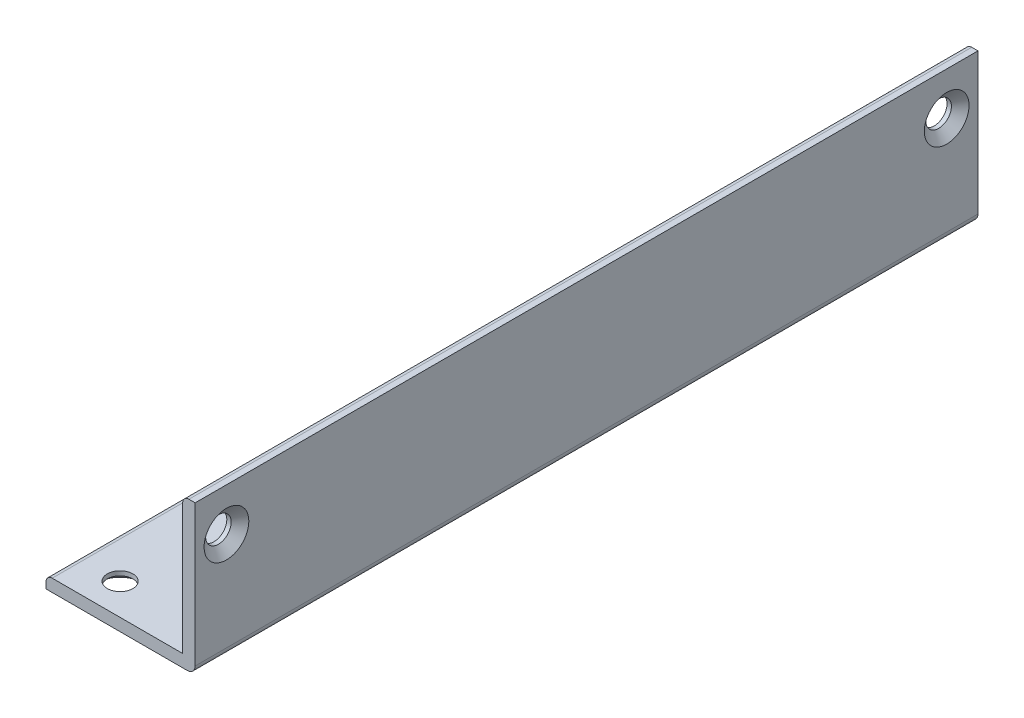
ISO-10303-21;
HEADER;
FILE_DESCRIPTION(('STEP AP214'),'2;1');
FILE_NAME('part.step','',(''),(''),'','','');
FILE_SCHEMA(('AUTOMOTIVE_DESIGN { 1 0 10303 214 1 1 1 1 }'));
ENDSEC;
DATA;
#1=APPLICATION_CONTEXT('core data for automotive mechanical design processes');
#2=APPLICATION_PROTOCOL_DEFINITION('international standard','automotive_design',2000,#1);
#3=PRODUCT_CONTEXT('',#1,'mechanical');
#4=PRODUCT('Part','Part','',(#3));
#5=PRODUCT_RELATED_PRODUCT_CATEGORY('part','',(#4));
#6=PRODUCT_DEFINITION_FORMATION('','',#4);
#7=PRODUCT_DEFINITION_CONTEXT('part definition',#1,'design');
#8=PRODUCT_DEFINITION('design','',#6,#7);
#9=PRODUCT_DEFINITION_SHAPE('','',#8);
#10=(LENGTH_UNIT() NAMED_UNIT(*) SI_UNIT(.MILLI.,.METRE.));
#11=(NAMED_UNIT(*) PLANE_ANGLE_UNIT() SI_UNIT($,.RADIAN.));
#12=(NAMED_UNIT(*) SI_UNIT($,.STERADIAN.) SOLID_ANGLE_UNIT());
#13=UNCERTAINTY_MEASURE_WITH_UNIT(LENGTH_MEASURE(1.E-05),#10,'distance_accuracy_value','');
#14=(GEOMETRIC_REPRESENTATION_CONTEXT(3) GLOBAL_UNCERTAINTY_ASSIGNED_CONTEXT((#13)) GLOBAL_UNIT_ASSIGNED_CONTEXT((#10,
#11,#12)) REPRESENTATION_CONTEXT('',''));
#15=CARTESIAN_POINT('',(0.,0.,0.));
#16=DIRECTION('',(0.,0.,1.));
#17=DIRECTION('',(1.,0.,0.));
#18=AXIS2_PLACEMENT_3D('',#15,#16,#17);
#19=CARTESIAN_POINT('',(8.73125,18.25625,-50.));
#20=DIRECTION('',(0.,0.,-1.));
#21=DIRECTION('',(-1.,0.,0.));
#22=AXIS2_PLACEMENT_3D('',#19,#20,#21);
#23=PLANE('',#22);
#24=DIRECTION('',(-1.,0.,0.));
#25=VECTOR('',#24,1.);
#26=CARTESIAN_POINT('',(7.14375000000001,1.5875,-50.));
#27=LINE('',#26,#25);
#28=CARTESIAN_POINT('',(7.93750000000001,1.5875,-50.));
#29=VERTEX_POINT('',#28);
#30=CARTESIAN_POINT('',(-8.73125,1.5875,-50.));
#31=VERTEX_POINT('',#30);
#32=EDGE_CURVE('E220',#29,#31,#27,.T.);
#33=ORIENTED_EDGE('',*,*,#32,.F.);
#34=DIRECTION('',(0.,-1.,0.));
#35=VECTOR('',#34,1.);
#36=CARTESIAN_POINT('',(7.9375,18.25625,-50.));
#37=LINE('',#36,#35);
#38=CARTESIAN_POINT('',(7.9375,18.25625,-50.));
#39=VERTEX_POINT('',#38);
#40=EDGE_CURVE('E148',#39,#29,#37,.T.);
#41=ORIENTED_EDGE('',*,*,#40,.F.);
#42=CARTESIAN_POINT('',(8.73125,18.25625,-50.));
#43=DIRECTION('',(0.,0.,1.));
#44=DIRECTION('',(-1.,0.,0.));
#45=AXIS2_PLACEMENT_3D('',#42,#43,#44);
#46=CIRCLE('',#45,0.793749999999999);
#47=CARTESIAN_POINT('',(8.73125,19.05,-50.));
#48=VERTEX_POINT('',#47);
#49=EDGE_CURVE('E217',#48,#39,#46,.T.);
#50=ORIENTED_EDGE('',*,*,#49,.F.);
#51=DIRECTION('',(-1.,0.,0.));
#52=VECTOR('',#51,1.);
#53=CARTESIAN_POINT('',(8.73125,19.05,-50.));
#54=LINE('',#53,#52);
#55=CARTESIAN_POINT('',(9.525,19.05,-50.));
#56=VERTEX_POINT('',#55);
#57=EDGE_CURVE('E215',#56,#48,#54,.T.);
#58=ORIENTED_EDGE('',*,*,#57,.F.);
#59=DIRECTION('',(0.,1.,0.));
#60=VECTOR('',#59,1.);
#61=CARTESIAN_POINT('',(9.525,0.,-50.));
#62=LINE('',#61,#60);
#63=CARTESIAN_POINT('',(9.525,1.,-50.));
#64=VERTEX_POINT('',#63);
#65=EDGE_CURVE('E213',#64,#56,#62,.T.);
#66=ORIENTED_EDGE('',*,*,#65,.F.);
#67=CARTESIAN_POINT('',(8.525,1.,-50.));
#68=DIRECTION('',(0.,0.,-1.));
#69=DIRECTION('',(-1.,0.,0.));
#70=AXIS2_PLACEMENT_3D('',#67,#68,#69);
#71=CIRCLE('',#70,1.);
#72=CARTESIAN_POINT('',(8.525,0.,-50.));
#73=VERTEX_POINT('',#72);
#74=EDGE_CURVE('E253',#64,#73,#71,.T.);
#75=ORIENTED_EDGE('',*,*,#74,.T.);
#76=DIRECTION('',(1.,0.,0.));
#77=VECTOR('',#76,1.);
#78=CARTESIAN_POINT('',(-9.525,0.,-50.));
#79=LINE('',#78,#77);
#80=CARTESIAN_POINT('',(-9.525,0.,-50.));
#81=VERTEX_POINT('',#80);
#82=EDGE_CURVE('E211',#81,#73,#79,.T.);
#83=ORIENTED_EDGE('',*,*,#82,.F.);
#84=DIRECTION('',(0.,-1.,0.));
#85=VECTOR('',#84,1.);
#86=CARTESIAN_POINT('',(-9.525,0.793749999999998,-50.));
#87=LINE('',#86,#85);
#88=CARTESIAN_POINT('',(-9.525,0.793749999999998,-50.));
#89=VERTEX_POINT('',#88);
#90=EDGE_CURVE('E208',#89,#81,#87,.T.);
#91=ORIENTED_EDGE('',*,*,#90,.F.);
#92=CARTESIAN_POINT('',(-8.73125,0.793749999999998,-50.));
#93=DIRECTION('',(0.,0.,1.));
#94=DIRECTION('',(-1.,0.,0.));
#95=AXIS2_PLACEMENT_3D('',#92,#93,#94);
#96=CIRCLE('',#95,0.793749999999998);
#97=EDGE_CURVE('E194',#31,#89,#96,.T.);
#98=ORIENTED_EDGE('',*,*,#97,.F.);
#99=EDGE_LOOP('',(#33,#41,#50,#58,#66,#75,#83,#91,#98));
#100=FACE_BOUND('',#99,.T.);
#101=ADVANCED_FACE('F35',(#100),#23,.T.);
#102=CARTESIAN_POINT('',(-9.525,0.793749999999998,50.));
#103=DIRECTION('',(1.,0.,0.));
#104=DIRECTION('',(0.,0.,-1.));
#105=AXIS2_PLACEMENT_3D('',#102,#103,#104);
#106=PLANE('',#105);
#107=ORIENTED_EDGE('',*,*,#90,.T.);
#108=DIRECTION('',(0.,0.,-1.));
#109=VECTOR('',#108,1.);
#110=CARTESIAN_POINT('',(-9.525,0.,50.));
#111=LINE('',#110,#109);
#112=CARTESIAN_POINT('',(-9.525,0.,50.));
#113=VERTEX_POINT('',#112);
#114=EDGE_CURVE('E239',#113,#81,#111,.T.);
#115=ORIENTED_EDGE('',*,*,#114,.F.);
#116=DIRECTION('',(0.,-1.,0.));
#117=VECTOR('',#116,1.);
#118=CARTESIAN_POINT('',(-9.525,0.793749999999998,50.));
#119=LINE('',#118,#117);
#120=CARTESIAN_POINT('',(-9.525,0.793749999999998,50.));
#121=VERTEX_POINT('',#120);
#122=EDGE_CURVE('E190',#121,#113,#119,.T.);
#123=ORIENTED_EDGE('',*,*,#122,.F.);
#124=DIRECTION('',(0.,0.,-1.));
#125=VECTOR('',#124,1.);
#126=CARTESIAN_POINT('',(-9.525,0.793749999999998,50.));
#127=LINE('',#126,#125);
#128=EDGE_CURVE('E207',#121,#89,#127,.T.);
#129=ORIENTED_EDGE('',*,*,#128,.T.);
#130=EDGE_LOOP('',(#107,#115,#123,#129));
#131=FACE_BOUND('',#130,.T.);
#132=ADVANCED_FACE('F294',(#131),#106,.F.);
#133=CARTESIAN_POINT('',(-9.525,0.,50.));
#134=DIRECTION('',(0.,1.,0.));
#135=DIRECTION('',(0.,0.,1.));
#136=AXIS2_PLACEMENT_3D('',#133,#134,#135);
#137=PLANE('',#136);
#138=CARTESIAN_POINT('',(-4.06250000000001,0.,46.));
#139=DIRECTION('',(0.,-1.,0.));
#140=DIRECTION('',(0.,0.,-1.));
#141=AXIS2_PLACEMENT_3D('',#138,#139,#140);
#142=CIRCLE('',#141,2.8575);
#143=CARTESIAN_POINT('',(-4.06250000000001,0.,43.1425));
#144=VERTEX_POINT('',#143);
#145=EDGE_CURVE('E176',#144,#144,#142,.T.);
#146=ORIENTED_EDGE('',*,*,#145,.F.);
#147=EDGE_LOOP('',(#146));
#148=FACE_BOUND('',#147,.T.);
#149=CARTESIAN_POINT('',(-4.0625,0.,-46.));
#150=DIRECTION('',(0.,-1.,0.));
#151=DIRECTION('',(0.,0.,-1.));
#152=AXIS2_PLACEMENT_3D('',#149,#150,#151);
#153=CIRCLE('',#152,2.8575);
#154=CARTESIAN_POINT('',(-4.0625,0.,-48.8575));
#155=VERTEX_POINT('',#154);
#156=EDGE_CURVE('E183',#155,#155,#153,.T.);
#157=ORIENTED_EDGE('',*,*,#156,.F.);
#158=EDGE_LOOP('',(#157));
#159=FACE_BOUND('',#158,.T.);
#160=ORIENTED_EDGE('',*,*,#82,.T.);
#161=DIRECTION('',(0.,0.,-1.));
#162=VECTOR('',#161,1.);
#163=CARTESIAN_POINT('',(8.525,0.,50.));
#164=LINE('',#163,#162);
#165=CARTESIAN_POINT('',(8.525,0.,50.));
#166=VERTEX_POINT('',#165);
#167=EDGE_CURVE('E43',#73,#166,#164,.F.);
#168=ORIENTED_EDGE('',*,*,#167,.T.);
#169=DIRECTION('',(1.,0.,0.));
#170=VECTOR('',#169,1.);
#171=CARTESIAN_POINT('',(-9.525,0.,50.));
#172=LINE('',#171,#170);
#173=EDGE_CURVE('E193',#113,#166,#172,.T.);
#174=ORIENTED_EDGE('',*,*,#173,.F.);
#175=ORIENTED_EDGE('',*,*,#114,.T.);
#176=EDGE_LOOP('',(#160,#168,#174,#175));
#177=FACE_BOUND('',#176,.T.);
#178=ADVANCED_FACE('F260',(#148,#159,#177),#137,.F.);
#179=CARTESIAN_POINT('',(9.525,0.,50.));
#180=DIRECTION('',(-1.,0.,0.));
#181=DIRECTION('',(0.,0.,1.));
#182=AXIS2_PLACEMENT_3D('',#179,#180,#181);
#183=PLANE('',#182);
#184=CARTESIAN_POINT('',(9.525,13.5875,46.));
#185=DIRECTION('',(1.,0.,0.));
#186=DIRECTION('',(0.,0.,-1.));
#187=AXIS2_PLACEMENT_3D('',#184,#185,#186);
#188=CIRCLE('',#187,2.8575);
#189=CARTESIAN_POINT('',(9.525,13.5875,43.1425));
#190=VERTEX_POINT('',#189);
#191=EDGE_CURVE('E162',#190,#190,#188,.T.);
#192=ORIENTED_EDGE('',*,*,#191,.F.);
#193=EDGE_LOOP('',(#192));
#194=FACE_BOUND('',#193,.T.);
#195=CARTESIAN_POINT('',(9.525,13.5875,-46.));
#196=DIRECTION('',(1.,0.,0.));
#197=DIRECTION('',(0.,0.,-1.));
#198=AXIS2_PLACEMENT_3D('',#195,#196,#197);
#199=CIRCLE('',#198,2.8575);
#200=CARTESIAN_POINT('',(9.525,13.5875,-48.8575));
#201=VERTEX_POINT('',#200);
#202=EDGE_CURVE('E169',#201,#201,#199,.T.);
#203=ORIENTED_EDGE('',*,*,#202,.F.);
#204=EDGE_LOOP('',(#203));
#205=FACE_BOUND('',#204,.T.);
#206=DIRECTION('',(0.,1.,0.));
#207=VECTOR('',#206,1.);
#208=CARTESIAN_POINT('',(9.525,0.,50.));
#209=LINE('',#208,#207);
#210=CARTESIAN_POINT('',(9.525,1.,50.));
#211=VERTEX_POINT('',#210);
#212=CARTESIAN_POINT('',(9.525,19.05,50.));
#213=VERTEX_POINT('',#212);
#214=EDGE_CURVE('E196',#211,#213,#209,.T.);
#215=ORIENTED_EDGE('',*,*,#214,.F.);
#216=DIRECTION('',(0.,0.,-1.));
#217=VECTOR('',#216,1.);
#218=CARTESIAN_POINT('',(9.525,1.,50.));
#219=LINE('',#218,#217);
#220=EDGE_CURVE('E242',#211,#64,#219,.T.);
#221=ORIENTED_EDGE('',*,*,#220,.T.);
#222=ORIENTED_EDGE('',*,*,#65,.T.);
#223=DIRECTION('',(0.,0.,-1.));
#224=VECTOR('',#223,1.);
#225=CARTESIAN_POINT('',(9.525,19.05,50.));
#226=LINE('',#225,#224);
#227=EDGE_CURVE('E236',#213,#56,#226,.T.);
#228=ORIENTED_EDGE('',*,*,#227,.F.);
#229=EDGE_LOOP('',(#215,#221,#222,#228));
#230=FACE_BOUND('',#229,.T.);
#231=ADVANCED_FACE('F268',(#194,#205,#230),#183,.F.);
#232=CARTESIAN_POINT('',(8.73125,19.05,50.));
#233=DIRECTION('',(0.,-1.,0.));
#234=DIRECTION('',(0.,0.,-1.));
#235=AXIS2_PLACEMENT_3D('',#232,#233,#234);
#236=PLANE('',#235);
#237=ORIENTED_EDGE('',*,*,#57,.T.);
#238=DIRECTION('',(0.,0.,-1.));
#239=VECTOR('',#238,1.);
#240=CARTESIAN_POINT('',(8.73125,19.05,50.));
#241=LINE('',#240,#239);
#242=CARTESIAN_POINT('',(8.73125,19.05,50.));
#243=VERTEX_POINT('',#242);
#244=EDGE_CURVE('E233',#243,#48,#241,.T.);
#245=ORIENTED_EDGE('',*,*,#244,.F.);
#246=DIRECTION('',(-1.,0.,0.));
#247=VECTOR('',#246,1.);
#248=CARTESIAN_POINT('',(8.73125,19.05,50.));
#249=LINE('',#248,#247);
#250=EDGE_CURVE('E198',#213,#243,#249,.T.);
#251=ORIENTED_EDGE('',*,*,#250,.F.);
#252=ORIENTED_EDGE('',*,*,#227,.T.);
#253=EDGE_LOOP('',(#237,#245,#251,#252));
#254=FACE_BOUND('',#253,.T.);
#255=ADVANCED_FACE('F272',(#254),#236,.F.);
#256=CARTESIAN_POINT('',(8.73125,18.25625,50.));
#257=DIRECTION('',(0.,0.,-1.));
#258=DIRECTION('',(-1.,0.,0.));
#259=AXIS2_PLACEMENT_3D('',#256,#257,#258);
#260=CYLINDRICAL_SURFACE('',#259,0.793749999999999);
#261=ORIENTED_EDGE('',*,*,#49,.T.);
#262=DIRECTION('',(0.,0.,-1.));
#263=VECTOR('',#262,1.);
#264=CARTESIAN_POINT('',(7.9375,18.25625,50.));
#265=LINE('',#264,#263);
#266=CARTESIAN_POINT('',(7.9375,18.25625,50.));
#267=VERTEX_POINT('',#266);
#268=EDGE_CURVE('E231',#267,#39,#265,.T.);
#269=ORIENTED_EDGE('',*,*,#268,.F.);
#270=CARTESIAN_POINT('',(8.73125,18.25625,50.));
#271=DIRECTION('',(0.,0.,1.));
#272=DIRECTION('',(-1.,0.,0.));
#273=AXIS2_PLACEMENT_3D('',#270,#271,#272);
#274=CIRCLE('',#273,0.793749999999999);
#275=EDGE_CURVE('E200',#243,#267,#274,.T.);
#276=ORIENTED_EDGE('',*,*,#275,.F.);
#277=ORIENTED_EDGE('',*,*,#244,.T.);
#278=EDGE_LOOP('',(#261,#269,#276,#277));
#279=FACE_BOUND('',#278,.T.);
#280=ADVANCED_FACE('F277',(#279),#260,.T.);
#281=CARTESIAN_POINT('',(7.9375,18.25625,50.));
#282=DIRECTION('',(1.,0.,0.));
#283=DIRECTION('',(0.,1.,0.));
#284=AXIS2_PLACEMENT_3D('',#281,#282,#283);
#285=PLANE('',#284);
#286=ORIENTED_EDGE('',*,*,#40,.T.);
#287=DIRECTION('',(0.,0.,-1.));
#288=VECTOR('',#287,1.);
#289=CARTESIAN_POINT('',(7.93750000000001,1.5875,-25.));
#290=LINE('',#289,#288);
#291=CARTESIAN_POINT('',(7.93750000000001,1.5875,-25.));
#292=VERTEX_POINT('',#291);
#293=EDGE_CURVE('E128',#292,#29,#290,.T.);
#294=ORIENTED_EDGE('',*,*,#293,.F.);
#295=DIRECTION('',(0.,1.,0.));
#296=VECTOR('',#295,1.);
#297=CARTESIAN_POINT('',(7.93750000000001,6.5875,-25.));
#298=LINE('',#297,#296);
#299=CARTESIAN_POINT('',(7.93750000000001,2.38125,-25.));
#300=VERTEX_POINT('',#299);
#301=EDGE_CURVE('E134',#292,#300,#298,.T.);
#302=ORIENTED_EDGE('',*,*,#301,.T.);
#303=DIRECTION('',(0.,0.,-1.));
#304=VECTOR('',#303,1.);
#305=CARTESIAN_POINT('',(7.93750000000001,2.38125,50.));
#306=LINE('',#305,#304);
#307=CARTESIAN_POINT('',(7.93750000000001,2.38125,25.));
#308=VERTEX_POINT('',#307);
#309=EDGE_CURVE('E229',#308,#300,#306,.T.);
#310=ORIENTED_EDGE('',*,*,#309,.F.);
#311=DIRECTION('',(0.,1.,0.));
#312=VECTOR('',#311,1.);
#313=CARTESIAN_POINT('',(7.93750000000001,6.5875,25.));
#314=LINE('',#313,#312);
#315=CARTESIAN_POINT('',(7.93750000000001,1.5875,25.));
#316=VERTEX_POINT('',#315);
#317=EDGE_CURVE('E154',#316,#308,#314,.T.);
#318=ORIENTED_EDGE('',*,*,#317,.F.);
#319=DIRECTION('',(0.,0.,1.));
#320=VECTOR('',#319,1.);
#321=CARTESIAN_POINT('',(7.93750000000001,1.5875,25.));
#322=LINE('',#321,#320);
#323=CARTESIAN_POINT('',(7.93750000000001,1.5875,50.));
#324=VERTEX_POINT('',#323);
#325=EDGE_CURVE('E156',#316,#324,#322,.T.);
#326=ORIENTED_EDGE('',*,*,#325,.T.);
#327=DIRECTION('',(0.,-1.,0.));
#328=VECTOR('',#327,1.);
#329=CARTESIAN_POINT('',(7.9375,18.25625,50.));
#330=LINE('',#329,#328);
#331=EDGE_CURVE('E202',#267,#324,#330,.T.);
#332=ORIENTED_EDGE('',*,*,#331,.F.);
#333=ORIENTED_EDGE('',*,*,#268,.T.);
#334=EDGE_LOOP('',(#286,#294,#302,#310,#318,#326,#332,#333));
#335=FACE_BOUND('',#334,.T.);
#336=CARTESIAN_POINT('',(7.93750000000001,13.5875,-46.));
#337=DIRECTION('',(1.,0.,0.));
#338=DIRECTION('',(0.,1.,0.));
#339=AXIS2_PLACEMENT_3D('',#336,#337,#338);
#340=CIRCLE('',#339,1.63195);
#341=CARTESIAN_POINT('',(7.93750000000001,15.21945,-46.));
#342=VERTEX_POINT('',#341);
#343=EDGE_CURVE('E175',#342,#342,#340,.T.);
#344=ORIENTED_EDGE('',*,*,#343,.T.);
#345=EDGE_LOOP('',(#344));
#346=FACE_BOUND('',#345,.T.);
#347=CARTESIAN_POINT('',(7.93750000000001,13.5875,46.));
#348=DIRECTION('',(1.,0.,0.));
#349=DIRECTION('',(0.,1.,0.));
#350=AXIS2_PLACEMENT_3D('',#347,#348,#349);
#351=CIRCLE('',#350,1.63195);
#352=CARTESIAN_POINT('',(7.93750000000001,15.21945,46.));
#353=VERTEX_POINT('',#352);
#354=EDGE_CURVE('E168',#353,#353,#351,.T.);
#355=ORIENTED_EDGE('',*,*,#354,.T.);
#356=EDGE_LOOP('',(#355));
#357=FACE_BOUND('',#356,.T.);
#358=ADVANCED_FACE('F144',(#335,#346,#357),#285,.F.);
#359=CARTESIAN_POINT('',(7.14375000000001,2.38125,50.));
#360=DIRECTION('',(0.,0.,-1.));
#361=DIRECTION('',(-1.,0.,0.));
#362=AXIS2_PLACEMENT_3D('',#359,#360,#361);
#363=CYLINDRICAL_SURFACE('',#362,0.793749999999999);
#364=ORIENTED_EDGE('',*,*,#309,.T.);
#365=CARTESIAN_POINT('',(7.14375000000001,2.38125,-25.));
#366=DIRECTION('',(0.,0.,1.));
#367=DIRECTION('',(1.,0.,0.));
#368=AXIS2_PLACEMENT_3D('',#365,#366,#367);
#369=CIRCLE('',#368,0.793749999999999);
#370=CARTESIAN_POINT('',(7.14375000000001,1.5875,-25.));
#371=VERTEX_POINT('',#370);
#372=EDGE_CURVE('E138',#300,#371,#369,.F.);
#373=ORIENTED_EDGE('',*,*,#372,.T.);
#374=DIRECTION('',(0.,0.,-1.));
#375=VECTOR('',#374,1.);
#376=CARTESIAN_POINT('',(7.14375000000001,1.5875,50.));
#377=LINE('',#376,#375);
#378=CARTESIAN_POINT('',(7.14375000000001,1.5875,25.));
#379=VERTEX_POINT('',#378);
#380=EDGE_CURVE('E131',#379,#371,#377,.T.);
#381=ORIENTED_EDGE('',*,*,#380,.F.);
#382=CARTESIAN_POINT('',(7.14375000000001,2.38125,25.));
#383=DIRECTION('',(0.,0.,-1.));
#384=DIRECTION('',(-1.,0.,0.));
#385=AXIS2_PLACEMENT_3D('',#382,#383,#384);
#386=CIRCLE('',#385,0.793749999999999);
#387=EDGE_CURVE('E159',#379,#308,#386,.F.);
#388=ORIENTED_EDGE('',*,*,#387,.T.);
#389=EDGE_LOOP('',(#364,#373,#381,#388));
#390=FACE_BOUND('',#389,.T.);
#391=ADVANCED_FACE('F282',(#390),#363,.F.);
#392=CARTESIAN_POINT('',(7.14375000000001,1.5875,50.));
#393=DIRECTION('',(0.,-1.,0.));
#394=DIRECTION('',(1.,0.,0.));
#395=AXIS2_PLACEMENT_3D('',#392,#393,#394);
#396=PLANE('',#395);
#397=ORIENTED_EDGE('',*,*,#32,.T.);
#398=DIRECTION('',(0.,0.,-1.));
#399=VECTOR('',#398,1.);
#400=CARTESIAN_POINT('',(-8.73125,1.5875,50.));
#401=LINE('',#400,#399);
#402=CARTESIAN_POINT('',(-8.73125,1.5875,50.));
#403=VERTEX_POINT('',#402);
#404=EDGE_CURVE('E225',#403,#31,#401,.T.);
#405=ORIENTED_EDGE('',*,*,#404,.F.);
#406=DIRECTION('',(-1.,0.,0.));
#407=VECTOR('',#406,1.);
#408=CARTESIAN_POINT('',(7.14375000000001,1.5875,50.));
#409=LINE('',#408,#407);
#410=EDGE_CURVE('E50',#324,#403,#409,.T.);
#411=ORIENTED_EDGE('',*,*,#410,.F.);
#412=ORIENTED_EDGE('',*,*,#325,.F.);
#413=DIRECTION('',(1.,0.,0.));
#414=VECTOR('',#413,1.);
#415=CARTESIAN_POINT('',(2.9375,1.5875,25.));
#416=LINE('',#415,#414);
#417=EDGE_CURVE('E150',#379,#316,#416,.T.);
#418=ORIENTED_EDGE('',*,*,#417,.F.);
#419=ORIENTED_EDGE('',*,*,#380,.T.);
#420=DIRECTION('',(1.,0.,0.));
#421=VECTOR('',#420,1.);
#422=CARTESIAN_POINT('',(2.9375,1.5875,-25.));
#423=LINE('',#422,#421);
#424=EDGE_CURVE('E123',#371,#292,#423,.T.);
#425=ORIENTED_EDGE('',*,*,#424,.T.);
#426=ORIENTED_EDGE('',*,*,#293,.T.);
#427=EDGE_LOOP('',(#397,#405,#411,#412,#418,#419,#425,#426));
#428=FACE_BOUND('',#427,.T.);
#429=CARTESIAN_POINT('',(-4.0625,1.5875,-46.));
#430=DIRECTION('',(0.,-1.,0.));
#431=DIRECTION('',(1.,0.,0.));
#432=AXIS2_PLACEMENT_3D('',#429,#430,#431);
#433=CIRCLE('',#432,1.63195);
#434=CARTESIAN_POINT('',(-2.43055,1.5875,-46.));
#435=VERTEX_POINT('',#434);
#436=EDGE_CURVE('E189',#435,#435,#433,.T.);
#437=ORIENTED_EDGE('',*,*,#436,.T.);
#438=EDGE_LOOP('',(#437));
#439=FACE_BOUND('',#438,.T.);
#440=CARTESIAN_POINT('',(-4.06250000000001,1.5875,46.));
#441=DIRECTION('',(0.,-1.,0.));
#442=DIRECTION('',(1.,0.,0.));
#443=AXIS2_PLACEMENT_3D('',#440,#441,#442);
#444=CIRCLE('',#443,1.63195);
#445=CARTESIAN_POINT('',(-2.43055000000001,1.5875,46.));
#446=VERTEX_POINT('',#445);
#447=EDGE_CURVE('E182',#446,#446,#444,.T.);
#448=ORIENTED_EDGE('',*,*,#447,.T.);
#449=EDGE_LOOP('',(#448));
#450=FACE_BOUND('',#449,.T.);
#451=ADVANCED_FACE('F125',(#428,#439,#450),#396,.F.);
#452=CARTESIAN_POINT('',(-8.73125,0.793749999999998,50.));
#453=DIRECTION('',(0.,0.,-1.));
#454=DIRECTION('',(-1.,0.,0.));
#455=AXIS2_PLACEMENT_3D('',#452,#453,#454);
#456=CYLINDRICAL_SURFACE('',#455,0.793749999999998);
#457=ORIENTED_EDGE('',*,*,#97,.T.);
#458=ORIENTED_EDGE('',*,*,#128,.F.);
#459=CARTESIAN_POINT('',(-8.73125,0.793749999999998,50.));
#460=DIRECTION('',(0.,0.,1.));
#461=DIRECTION('',(-1.,0.,0.));
#462=AXIS2_PLACEMENT_3D('',#459,#460,#461);
#463=CIRCLE('',#462,0.793749999999998);
#464=EDGE_CURVE('E205',#403,#121,#463,.T.);
#465=ORIENTED_EDGE('',*,*,#464,.F.);
#466=ORIENTED_EDGE('',*,*,#404,.T.);
#467=EDGE_LOOP('',(#457,#458,#465,#466));
#468=FACE_BOUND('',#467,.T.);
#469=ADVANCED_FACE('F303',(#468),#456,.T.);
#470=CARTESIAN_POINT('',(8.73125,18.25625,50.));
#471=DIRECTION('',(0.,0.,-1.));
#472=DIRECTION('',(-1.,0.,0.));
#473=AXIS2_PLACEMENT_3D('',#470,#471,#472);
#474=PLANE('',#473);
#475=ORIENTED_EDGE('',*,*,#331,.T.);
#476=ORIENTED_EDGE('',*,*,#410,.T.);
#477=ORIENTED_EDGE('',*,*,#464,.T.);
#478=ORIENTED_EDGE('',*,*,#122,.T.);
#479=ORIENTED_EDGE('',*,*,#173,.T.);
#480=CARTESIAN_POINT('',(8.525,1.,50.));
#481=DIRECTION('',(0.,0.,-1.));
#482=DIRECTION('',(-1.,0.,0.));
#483=AXIS2_PLACEMENT_3D('',#480,#481,#482);
#484=CIRCLE('',#483,1.);
#485=EDGE_CURVE('E11',#166,#211,#484,.F.);
#486=ORIENTED_EDGE('',*,*,#485,.T.);
#487=ORIENTED_EDGE('',*,*,#214,.T.);
#488=ORIENTED_EDGE('',*,*,#250,.T.);
#489=ORIENTED_EDGE('',*,*,#275,.T.);
#490=EDGE_LOOP('',(#475,#476,#477,#478,#479,#486,#487,#488,#489));
#491=FACE_BOUND('',#490,.T.);
#492=ADVANCED_FACE('F265',(#491),#474,.F.);
#493=CARTESIAN_POINT('',(-4.0625,0.,-46.));
#494=DIRECTION('',(0.,-1.,0.));
#495=DIRECTION('',(0.,0.,-1.));
#496=AXIS2_PLACEMENT_3D('',#493,#494,#495);
#497=CYLINDRICAL_SURFACE('',#496,1.63195);
#498=CARTESIAN_POINT('',(-4.0625,1.02835855298932,-46.));
#499=DIRECTION('',(0.,-1.,0.));
#500=DIRECTION('',(0.,0.,-1.));
#501=AXIS2_PLACEMENT_3D('',#498,#499,#500);
#502=CIRCLE('',#501,1.63195);
#503=CARTESIAN_POINT('',(-4.0625,1.02835855298932,-47.63195));
#504=VERTEX_POINT('',#503);
#505=EDGE_CURVE('E186',#504,#504,#502,.T.);
#506=ORIENTED_EDGE('',*,*,#505,.T.);
#507=EDGE_LOOP('',(#506));
#508=FACE_BOUND('',#507,.T.);
#509=ORIENTED_EDGE('',*,*,#436,.F.);
#510=EDGE_LOOP('',(#509));
#511=FACE_BOUND('',#510,.T.);
#512=ADVANCED_FACE('F331',(#508,#511),#497,.F.);
#513=CARTESIAN_POINT('',(-4.0625,0.,-46.));
#514=DIRECTION('',(0.,-1.,0.));
#515=DIRECTION('',(0.,0.,-1.));
#516=AXIS2_PLACEMENT_3D('',#513,#514,#515);
#517=CONICAL_SURFACE('',#516,2.8575,0.872664625997165);
#518=ORIENTED_EDGE('',*,*,#505,.F.);
#519=EDGE_LOOP('',(#518));
#520=FACE_BOUND('',#519,.T.);
#521=ORIENTED_EDGE('',*,*,#156,.T.);
#522=EDGE_LOOP('',(#521));
#523=FACE_BOUND('',#522,.T.);
#524=ADVANCED_FACE('F328',(#520,#523),#517,.F.);
#525=CARTESIAN_POINT('',(-4.06250000000001,0.,46.));
#526=DIRECTION('',(0.,-1.,0.));
#527=DIRECTION('',(0.,0.,-1.));
#528=AXIS2_PLACEMENT_3D('',#525,#526,#527);
#529=CYLINDRICAL_SURFACE('',#528,1.63195);
#530=CARTESIAN_POINT('',(-4.06250000000001,1.02835855298932,46.));
#531=DIRECTION('',(0.,-1.,0.));
#532=DIRECTION('',(0.,0.,-1.));
#533=AXIS2_PLACEMENT_3D('',#530,#531,#532);
#534=CIRCLE('',#533,1.63195);
#535=CARTESIAN_POINT('',(-4.06250000000001,1.02835855298932,44.36805));
#536=VERTEX_POINT('',#535);
#537=EDGE_CURVE('E179',#536,#536,#534,.T.);
#538=ORIENTED_EDGE('',*,*,#537,.T.);
#539=EDGE_LOOP('',(#538));
#540=FACE_BOUND('',#539,.T.);
#541=ORIENTED_EDGE('',*,*,#447,.F.);
#542=EDGE_LOOP('',(#541));
#543=FACE_BOUND('',#542,.T.);
#544=ADVANCED_FACE('F330',(#540,#543),#529,.F.);
#545=CARTESIAN_POINT('',(-4.06250000000001,0.,46.));
#546=DIRECTION('',(0.,-1.,0.));
#547=DIRECTION('',(0.,0.,-1.));
#548=AXIS2_PLACEMENT_3D('',#545,#546,#547);
#549=CONICAL_SURFACE('',#548,2.8575,0.872664625997165);
#550=ORIENTED_EDGE('',*,*,#537,.F.);
#551=EDGE_LOOP('',(#550));
#552=FACE_BOUND('',#551,.T.);
#553=ORIENTED_EDGE('',*,*,#145,.T.);
#554=EDGE_LOOP('',(#553));
#555=FACE_BOUND('',#554,.T.);
#556=ADVANCED_FACE('F338',(#552,#555),#549,.F.);
#557=CARTESIAN_POINT('',(9.525,13.5875,-46.));
#558=DIRECTION('',(1.,0.,0.));
#559=DIRECTION('',(0.,0.,-1.));
#560=AXIS2_PLACEMENT_3D('',#557,#558,#559);
#561=CYLINDRICAL_SURFACE('',#560,1.63195);
#562=CARTESIAN_POINT('',(8.49664144701068,13.5875,-46.));
#563=DIRECTION('',(1.,0.,0.));
#564=DIRECTION('',(0.,0.,-1.));
#565=AXIS2_PLACEMENT_3D('',#562,#563,#564);
#566=CIRCLE('',#565,1.63195);
#567=CARTESIAN_POINT('',(8.49664144701068,13.5875,-47.63195));
#568=VERTEX_POINT('',#567);
#569=EDGE_CURVE('E172',#568,#568,#566,.T.);
#570=ORIENTED_EDGE('',*,*,#569,.T.);
#571=EDGE_LOOP('',(#570));
#572=FACE_BOUND('',#571,.T.);
#573=ORIENTED_EDGE('',*,*,#343,.F.);
#574=EDGE_LOOP('',(#573));
#575=FACE_BOUND('',#574,.T.);
#576=ADVANCED_FACE('F346',(#572,#575),#561,.F.);
#577=CARTESIAN_POINT('',(9.525,13.5875,-46.));
#578=DIRECTION('',(1.,0.,0.));
#579=DIRECTION('',(0.,0.,-1.));
#580=AXIS2_PLACEMENT_3D('',#577,#578,#579);
#581=CONICAL_SURFACE('',#580,2.8575,0.872664625997165);
#582=ORIENTED_EDGE('',*,*,#569,.F.);
#583=EDGE_LOOP('',(#582));
#584=FACE_BOUND('',#583,.T.);
#585=ORIENTED_EDGE('',*,*,#202,.T.);
#586=EDGE_LOOP('',(#585));
#587=FACE_BOUND('',#586,.T.);
#588=ADVANCED_FACE('F350',(#584,#587),#581,.F.);
#589=CARTESIAN_POINT('',(9.525,13.5875,46.));
#590=DIRECTION('',(1.,0.,0.));
#591=DIRECTION('',(0.,0.,-1.));
#592=AXIS2_PLACEMENT_3D('',#589,#590,#591);
#593=CYLINDRICAL_SURFACE('',#592,1.63195);
#594=CARTESIAN_POINT('',(8.49664144701068,13.5875,46.));
#595=DIRECTION('',(1.,0.,0.));
#596=DIRECTION('',(0.,0.,-1.));
#597=AXIS2_PLACEMENT_3D('',#594,#595,#596);
#598=CIRCLE('',#597,1.63195);
#599=CARTESIAN_POINT('',(8.49664144701068,13.5875,44.36805));
#600=VERTEX_POINT('',#599);
#601=EDGE_CURVE('E165',#600,#600,#598,.T.);
#602=ORIENTED_EDGE('',*,*,#601,.T.);
#603=EDGE_LOOP('',(#602));
#604=FACE_BOUND('',#603,.T.);
#605=ORIENTED_EDGE('',*,*,#354,.F.);
#606=EDGE_LOOP('',(#605));
#607=FACE_BOUND('',#606,.T.);
#608=ADVANCED_FACE('F354',(#604,#607),#593,.F.);
#609=CARTESIAN_POINT('',(9.525,13.5875,46.));
#610=DIRECTION('',(1.,0.,0.));
#611=DIRECTION('',(0.,0.,-1.));
#612=AXIS2_PLACEMENT_3D('',#609,#610,#611);
#613=CONICAL_SURFACE('',#612,2.8575,0.872664625997165);
#614=ORIENTED_EDGE('',*,*,#601,.F.);
#615=EDGE_LOOP('',(#614));
#616=FACE_BOUND('',#615,.T.);
#617=ORIENTED_EDGE('',*,*,#191,.T.);
#618=EDGE_LOOP('',(#617));
#619=FACE_BOUND('',#618,.T.);
#620=ADVANCED_FACE('F291',(#616,#619),#613,.F.);
#621=CARTESIAN_POINT('',(8.525,1.,50.));
#622=DIRECTION('',(0.,0.,-1.));
#623=DIRECTION('',(-1.,0.,0.));
#624=AXIS2_PLACEMENT_3D('',#621,#622,#623);
#625=CYLINDRICAL_SURFACE('',#624,1.);
#626=ORIENTED_EDGE('',*,*,#485,.F.);
#627=ORIENTED_EDGE('',*,*,#167,.F.);
#628=ORIENTED_EDGE('',*,*,#74,.F.);
#629=ORIENTED_EDGE('',*,*,#220,.F.);
#630=EDGE_LOOP('',(#626,#627,#628,#629));
#631=FACE_BOUND('',#630,.T.);
#632=ADVANCED_FACE('F37',(#631),#625,.T.);
#633=CARTESIAN_POINT('',(0.,0.,25.));
#634=DIRECTION('',(0.,0.,-1.));
#635=DIRECTION('',(-1.,0.,0.));
#636=AXIS2_PLACEMENT_3D('',#633,#634,#635);
#637=PLANE('',#636);
#638=ORIENTED_EDGE('',*,*,#417,.T.);
#639=ORIENTED_EDGE('',*,*,#317,.T.);
#640=ORIENTED_EDGE('',*,*,#387,.F.);
#641=EDGE_LOOP('',(#638,#639,#640));
#642=FACE_BOUND('',#641,.T.);
#643=ADVANCED_FACE('F283',(#642),#637,.F.);
#644=CARTESIAN_POINT('',(0.,0.,-25.));
#645=DIRECTION('',(0.,0.,1.));
#646=DIRECTION('',(-1.,0.,0.));
#647=AXIS2_PLACEMENT_3D('',#644,#645,#646);
#648=PLANE('',#647);
#649=ORIENTED_EDGE('',*,*,#301,.F.);
#650=ORIENTED_EDGE('',*,*,#424,.F.);
#651=ORIENTED_EDGE('',*,*,#372,.F.);
#652=EDGE_LOOP('',(#649,#650,#651));
#653=FACE_BOUND('',#652,.T.);
#654=ADVANCED_FACE('F137',(#653),#648,.F.);
#655=CLOSED_SHELL('',(#101,#132,#178,#231,#255,#280,#358,#391,#451,#469,#492,#512,#524,#544,
#556,#576,#588,#608,#620,#632,#643,#654));
#656=MANIFOLD_SOLID_BREP('B2',#655);
#657=ADVANCED_BREP_SHAPE_REPRESENTATION('',(#18,#656),#14);
#658=SHAPE_DEFINITION_REPRESENTATION(#9,#657);
ENDSEC;
END-ISO-10303-21;
